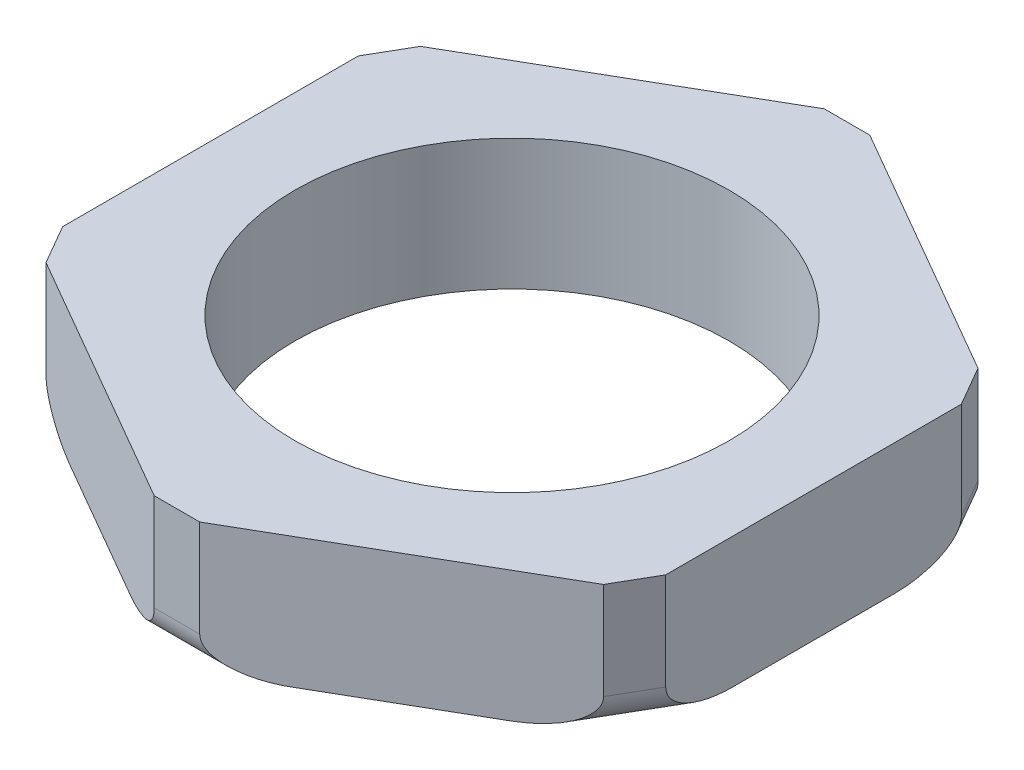
ISO-10303-21;
HEADER;
FILE_DESCRIPTION(('STEP AP214'),'2;1');
FILE_NAME('part.step','',(''),(''),'','','');
FILE_SCHEMA(('AUTOMOTIVE_DESIGN { 1 0 10303 214 1 1 1 1 }'));
ENDSEC;
DATA;
#1=APPLICATION_CONTEXT('core data for automotive mechanical design processes');
#2=APPLICATION_PROTOCOL_DEFINITION('international standard','automotive_design',2000,#1);
#3=PRODUCT_CONTEXT('',#1,'mechanical');
#4=PRODUCT('Part','Part','',(#3));
#5=PRODUCT_RELATED_PRODUCT_CATEGORY('part','',(#4));
#6=PRODUCT_DEFINITION_FORMATION('','',#4);
#7=PRODUCT_DEFINITION_CONTEXT('part definition',#1,'design');
#8=PRODUCT_DEFINITION('design','',#6,#7);
#9=PRODUCT_DEFINITION_SHAPE('','',#8);
#10=(LENGTH_UNIT() NAMED_UNIT(*) SI_UNIT(.MILLI.,.METRE.));
#11=(NAMED_UNIT(*) PLANE_ANGLE_UNIT() SI_UNIT($,.RADIAN.));
#12=(NAMED_UNIT(*) SI_UNIT($,.STERADIAN.) SOLID_ANGLE_UNIT());
#13=UNCERTAINTY_MEASURE_WITH_UNIT(LENGTH_MEASURE(1.E-05),#10,'distance_accuracy_value','');
#14=(GEOMETRIC_REPRESENTATION_CONTEXT(3) GLOBAL_UNCERTAINTY_ASSIGNED_CONTEXT((#13)) GLOBAL_UNIT_ASSIGNED_CONTEXT((#10,
#11,#12)) REPRESENTATION_CONTEXT('',''));
#15=CARTESIAN_POINT('',(0.,0.,0.));
#16=DIRECTION('',(0.,0.,1.));
#17=DIRECTION('',(1.,0.,0.));
#18=AXIS2_PLACEMENT_3D('',#15,#16,#17);
#19=CARTESIAN_POINT('',(-8.66025403784441,3.9,4.99999999999998));
#20=DIRECTION('',(-0.86602540378444,0.,0.499999999999998));
#21=DIRECTION('',(0.499999999999998,0.,0.86602540378444));
#22=AXIS2_PLACEMENT_3D('',#19,#20,#21);
#23=PLANE('',#22);
#24=DIRECTION('',(0.,-1.,0.));
#25=VECTOR('',#24,1.);
#26=CARTESIAN_POINT('',(-8.99999999999999,3.9,4.41154273188012));
#27=LINE('',#26,#25);
#28=CARTESIAN_POINT('',(-8.99999999999999,3.9,4.41154273188012));
#29=VERTEX_POINT('',#28);
#30=CARTESIAN_POINT('',(-8.99999999999999,1.,4.41154273188012));
#31=VERTEX_POINT('',#30);
#32=EDGE_CURVE('E217',#29,#31,#27,.T.);
#33=ORIENTED_EDGE('',*,*,#32,.T.);
#34=DIRECTION('',(-0.499999999999998,0.,-0.86602540378444));
#35=VECTOR('',#34,1.);
#36=CARTESIAN_POINT('',(-8.32050807568879,1.,5.58845726811988));
#37=LINE('',#36,#35);
#38=CARTESIAN_POINT('',(-8.32050807568879,1.,5.58845726811988));
#39=VERTEX_POINT('',#38);
#40=EDGE_CURVE('E168',#31,#39,#37,.F.);
#41=ORIENTED_EDGE('',*,*,#40,.T.);
#42=DIRECTION('',(0.,-1.,0.));
#43=VECTOR('',#42,1.);
#44=CARTESIAN_POINT('',(-8.32050807568879,3.9,5.58845726811988));
#45=LINE('',#44,#43);
#46=CARTESIAN_POINT('',(-8.32050807568879,3.9,5.58845726811988));
#47=VERTEX_POINT('',#46);
#48=EDGE_CURVE('E162',#47,#39,#45,.T.);
#49=ORIENTED_EDGE('',*,*,#48,.F.);
#50=DIRECTION('',(-0.499999999999998,0.,-0.86602540378444));
#51=VECTOR('',#50,1.);
#52=CARTESIAN_POINT('',(-8.66025403784441,3.9,4.99999999999998));
#53=LINE('',#52,#51);
#54=EDGE_CURVE('E165',#47,#29,#53,.T.);
#55=ORIENTED_EDGE('',*,*,#54,.T.);
#56=EDGE_LOOP('',(#33,#41,#49,#55));
#57=FACE_BOUND('',#56,.T.);
#58=ADVANCED_FACE('F37',(#57),#23,.T.);
#59=CARTESIAN_POINT('',(-4.49999999999999,3.9,7.79422863405994));
#60=DIRECTION('',(-0.5,0.,0.866025403784439));
#61=DIRECTION('',(0.866025403784439,0.,0.5));
#62=AXIS2_PLACEMENT_3D('',#59,#60,#61);
#63=PLANE('',#62);
#64=ORIENTED_EDGE('',*,*,#48,.T.);
#65=CARTESIAN_POINT('',(-6.58845726811993,1.,6.58845726811987));
#66=DIRECTION('',(-0.5,0.,0.866025403784439));
#67=DIRECTION('',(0.866025403784439,0.,0.5));
#68=AXIS2_PLACEMENT_3D('',#65,#66,#67);
#69=ELLIPSE('',#68,1.99999999999999,1.);
#70=CARTESIAN_POINT('',(-6.58845726811992,0.,6.58845726811987));
#71=VERTEX_POINT('',#70);
#72=EDGE_CURVE('E294',#39,#71,#69,.T.);
#73=ORIENTED_EDGE('',*,*,#72,.T.);
#74=DIRECTION('',(-0.866025403784439,0.,-0.5));
#75=VECTOR('',#74,1.);
#76=CARTESIAN_POINT('',(-4.49999999999999,0.,7.79422863405994));
#77=LINE('',#76,#75);
#78=CARTESIAN_POINT('',(-2.41154273188009,0.,8.99999999999999));
#79=VERTEX_POINT('',#78);
#80=EDGE_CURVE('E221',#79,#71,#77,.T.);
#81=ORIENTED_EDGE('',*,*,#80,.F.);
#82=CARTESIAN_POINT('',(-2.41154273188009,1.,8.99999999999999));
#83=DIRECTION('',(-0.5,0.,0.866025403784439));
#84=DIRECTION('',(0.866025403784439,0.,0.5));
#85=AXIS2_PLACEMENT_3D('',#82,#83,#84);
#86=ELLIPSE('',#85,2.,1.);
#87=CARTESIAN_POINT('',(-0.679491924311216,1.,9.99999999999999));
#88=VERTEX_POINT('',#87);
#89=EDGE_CURVE('E292',#79,#88,#86,.T.);
#90=ORIENTED_EDGE('',*,*,#89,.T.);
#91=DIRECTION('',(0.,-1.,0.));
#92=VECTOR('',#91,1.);
#93=CARTESIAN_POINT('',(-0.679491924311216,3.9,9.99999999999999));
#94=LINE('',#93,#92);
#95=CARTESIAN_POINT('',(-0.679491924311216,3.9,9.99999999999999));
#96=VERTEX_POINT('',#95);
#97=EDGE_CURVE('E173',#96,#88,#94,.T.);
#98=ORIENTED_EDGE('',*,*,#97,.F.);
#99=DIRECTION('',(-0.866025403784439,0.,-0.5));
#100=VECTOR('',#99,1.);
#101=CARTESIAN_POINT('',(-4.49999999999999,3.9,7.79422863405994));
#102=LINE('',#101,#100);
#103=EDGE_CURVE('E179',#96,#47,#102,.T.);
#104=ORIENTED_EDGE('',*,*,#103,.T.);
#105=EDGE_LOOP('',(#64,#73,#81,#90,#98,#104));
#106=FACE_BOUND('',#105,.T.);
#107=ADVANCED_FACE('F186',(#106),#63,.T.);
#108=CARTESIAN_POINT('',(0.,3.9,9.99999999999999));
#109=DIRECTION('',(0.,0.,1.));
#110=DIRECTION('',(1.,0.,0.));
#111=AXIS2_PLACEMENT_3D('',#108,#109,#110);
#112=PLANE('',#111);
#113=ORIENTED_EDGE('',*,*,#97,.T.);
#114=DIRECTION('',(-1.,0.,0.));
#115=VECTOR('',#114,1.);
#116=CARTESIAN_POINT('',(0.6794919243112,1.,9.99999999999999));
#117=LINE('',#116,#115);
#118=CARTESIAN_POINT('',(0.6794919243112,1.,9.99999999999999));
#119=VERTEX_POINT('',#118);
#120=EDGE_CURVE('E296',#88,#119,#117,.F.);
#121=ORIENTED_EDGE('',*,*,#120,.T.);
#122=DIRECTION('',(0.,-1.,0.));
#123=VECTOR('',#122,1.);
#124=CARTESIAN_POINT('',(0.6794919243112,3.9,9.99999999999999));
#125=LINE('',#124,#123);
#126=CARTESIAN_POINT('',(0.6794919243112,3.9,9.99999999999999));
#127=VERTEX_POINT('',#126);
#128=EDGE_CURVE('E261',#127,#119,#125,.T.);
#129=ORIENTED_EDGE('',*,*,#128,.F.);
#130=DIRECTION('',(-1.,0.,0.));
#131=VECTOR('',#130,1.);
#132=CARTESIAN_POINT('',(0.,3.9,9.99999999999999));
#133=LINE('',#132,#131);
#134=EDGE_CURVE('E188',#127,#96,#133,.T.);
#135=ORIENTED_EDGE('',*,*,#134,.T.);
#136=EDGE_LOOP('',(#113,#121,#129,#135));
#137=FACE_BOUND('',#136,.T.);
#138=ADVANCED_FACE('F356',(#137),#112,.T.);
#139=CARTESIAN_POINT('',(4.49999999999998,3.9,7.79422863405995));
#140=DIRECTION('',(0.499999999999998,0.,0.86602540378444));
#141=DIRECTION('',(0.86602540378444,0.,-0.499999999999998));
#142=AXIS2_PLACEMENT_3D('',#139,#140,#141);
#143=PLANE('',#142);
#144=ORIENTED_EDGE('',*,*,#128,.T.);
#145=CARTESIAN_POINT('',(2.41154273188008,1.,8.99999999999999));
#146=DIRECTION('',(0.499999999999998,0.,0.86602540378444));
#147=DIRECTION('',(0.86602540378444,0.,-0.499999999999998));
#148=AXIS2_PLACEMENT_3D('',#145,#146,#147);
#149=ELLIPSE('',#148,2.00000000000001,1.);
#150=CARTESIAN_POINT('',(2.41154273188008,0.,8.99999999999999));
#151=VERTEX_POINT('',#150);
#152=EDGE_CURVE('E300',#119,#151,#149,.T.);
#153=ORIENTED_EDGE('',*,*,#152,.T.);
#154=DIRECTION('',(-0.86602540378444,0.,0.499999999999998));
#155=VECTOR('',#154,1.);
#156=CARTESIAN_POINT('',(4.49999999999998,0.,7.79422863405995));
#157=LINE('',#156,#155);
#158=CARTESIAN_POINT('',(6.5884572681199,0.,6.58845726811989));
#159=VERTEX_POINT('',#158);
#160=EDGE_CURVE('E224',#159,#151,#157,.T.);
#161=ORIENTED_EDGE('',*,*,#160,.F.);
#162=CARTESIAN_POINT('',(6.5884572681199,1.,6.58845726811989));
#163=DIRECTION('',(0.499999999999998,0.,0.86602540378444));
#164=DIRECTION('',(0.86602540378444,0.,-0.499999999999998));
#165=AXIS2_PLACEMENT_3D('',#162,#163,#164);
#166=ELLIPSE('',#165,1.99999999999999,1.);
#167=CARTESIAN_POINT('',(8.32050807568877,1.,5.5884572681199));
#168=VERTEX_POINT('',#167);
#169=EDGE_CURVE('E298',#159,#168,#166,.T.);
#170=ORIENTED_EDGE('',*,*,#169,.T.);
#171=DIRECTION('',(0.,-1.,0.));
#172=VECTOR('',#171,1.);
#173=CARTESIAN_POINT('',(8.32050807568877,3.9,5.5884572681199));
#174=LINE('',#173,#172);
#175=CARTESIAN_POINT('',(8.32050807568877,3.9,5.5884572681199));
#176=VERTEX_POINT('',#175);
#177=EDGE_CURVE('E258',#176,#168,#174,.T.);
#178=ORIENTED_EDGE('',*,*,#177,.F.);
#179=DIRECTION('',(-0.86602540378444,0.,0.499999999999998));
#180=VECTOR('',#179,1.);
#181=CARTESIAN_POINT('',(4.49999999999998,3.9,7.79422863405995));
#182=LINE('',#181,#180);
#183=EDGE_CURVE('E190',#176,#127,#182,.T.);
#184=ORIENTED_EDGE('',*,*,#183,.T.);
#185=EDGE_LOOP('',(#144,#153,#161,#170,#178,#184));
#186=FACE_BOUND('',#185,.T.);
#187=ADVANCED_FACE('F359',(#186),#143,.T.);
#188=CARTESIAN_POINT('',(8.66025403784439,3.9,5.));
#189=DIRECTION('',(-0.866025403784439,0.,-0.5));
#190=DIRECTION('',(-0.5,0.,0.866025403784439));
#191=AXIS2_PLACEMENT_3D('',#188,#189,#190);
#192=PLANE('',#191);
#193=ORIENTED_EDGE('',*,*,#177,.T.);
#194=DIRECTION('',(0.5,0.,-0.866025403784439));
#195=VECTOR('',#194,1.);
#196=CARTESIAN_POINT('',(8.66025403784439,1.,5.));
#197=LINE('',#196,#195);
#198=CARTESIAN_POINT('',(9.,1.,4.4115427318801));
#199=VERTEX_POINT('',#198);
#200=EDGE_CURVE('E302',#168,#199,#197,.T.);
#201=ORIENTED_EDGE('',*,*,#200,.T.);
#202=DIRECTION('',(0.,-1.,0.));
#203=VECTOR('',#202,1.);
#204=CARTESIAN_POINT('',(9.,3.9,4.4115427318801));
#205=LINE('',#204,#203);
#206=CARTESIAN_POINT('',(9.,3.9,4.4115427318801));
#207=VERTEX_POINT('',#206);
#208=EDGE_CURVE('E255',#207,#199,#205,.T.);
#209=ORIENTED_EDGE('',*,*,#208,.F.);
#210=DIRECTION('',(0.5,0.,-0.866025403784439));
#211=VECTOR('',#210,1.);
#212=CARTESIAN_POINT('',(8.66025403784439,3.9,5.));
#213=LINE('',#212,#211);
#214=EDGE_CURVE('E196',#176,#207,#213,.T.);
#215=ORIENTED_EDGE('',*,*,#214,.F.);
#216=EDGE_LOOP('',(#193,#201,#209,#215));
#217=FACE_BOUND('',#216,.T.);
#218=ADVANCED_FACE('F365',(#217),#192,.F.);
#219=CARTESIAN_POINT('',(8.99999999999999,3.9,0.));
#220=DIRECTION('',(1.,0.,0.));
#221=DIRECTION('',(0.,0.,-1.));
#222=AXIS2_PLACEMENT_3D('',#219,#220,#221);
#223=PLANE('',#222);
#224=ORIENTED_EDGE('',*,*,#208,.T.);
#225=CARTESIAN_POINT('',(8.99999999999999,1.,2.41154273188011));
#226=DIRECTION('',(1.,0.,0.));
#227=DIRECTION('',(0.,0.,-1.));
#228=AXIS2_PLACEMENT_3D('',#225,#226,#227);
#229=ELLIPSE('',#228,1.99999999999999,1.);
#230=CARTESIAN_POINT('',(9.,0.,2.41154273188011));
#231=VERTEX_POINT('',#230);
#232=EDGE_CURVE('E307',#199,#231,#229,.T.);
#233=ORIENTED_EDGE('',*,*,#232,.T.);
#234=DIRECTION('',(0.,0.,1.));
#235=VECTOR('',#234,1.);
#236=CARTESIAN_POINT('',(8.99999999999999,0.,0.));
#237=LINE('',#236,#235);
#238=CARTESIAN_POINT('',(8.99999999999998,0.,-2.41154273188011));
#239=VERTEX_POINT('',#238);
#240=EDGE_CURVE('E227',#239,#231,#237,.T.);
#241=ORIENTED_EDGE('',*,*,#240,.F.);
#242=CARTESIAN_POINT('',(8.99999999999998,1.,-2.41154273188011));
#243=DIRECTION('',(1.,0.,0.));
#244=DIRECTION('',(0.,0.,-1.));
#245=AXIS2_PLACEMENT_3D('',#242,#243,#244);
#246=ELLIPSE('',#245,2.00000000000002,1.);
#247=CARTESIAN_POINT('',(8.99999999999998,1.,-4.41154273188012));
#248=VERTEX_POINT('',#247);
#249=EDGE_CURVE('E305',#239,#248,#246,.T.);
#250=ORIENTED_EDGE('',*,*,#249,.T.);
#251=DIRECTION('',(0.,-1.,0.));
#252=VECTOR('',#251,1.);
#253=CARTESIAN_POINT('',(8.99999999999998,3.9,-4.41154273188012));
#254=LINE('',#253,#252);
#255=CARTESIAN_POINT('',(8.99999999999998,3.9,-4.41154273188012));
#256=VERTEX_POINT('',#255);
#257=EDGE_CURVE('E253',#256,#248,#254,.T.);
#258=ORIENTED_EDGE('',*,*,#257,.F.);
#259=DIRECTION('',(0.,0.,1.));
#260=VECTOR('',#259,1.);
#261=CARTESIAN_POINT('',(8.99999999999999,3.9,0.));
#262=LINE('',#261,#260);
#263=EDGE_CURVE('E198',#256,#207,#262,.T.);
#264=ORIENTED_EDGE('',*,*,#263,.T.);
#265=EDGE_LOOP('',(#224,#233,#241,#250,#258,#264));
#266=FACE_BOUND('',#265,.T.);
#267=ADVANCED_FACE('F320',(#266),#223,.T.);
#268=CARTESIAN_POINT('',(8.66025403784439,3.9,-4.99999999999998));
#269=DIRECTION('',(0.86602540378444,0.,-0.499999999999998));
#270=DIRECTION('',(-0.499999999999998,0.,-0.86602540378444));
#271=AXIS2_PLACEMENT_3D('',#268,#269,#270);
#272=PLANE('',#271);
#273=ORIENTED_EDGE('',*,*,#257,.T.);
#274=DIRECTION('',(0.499999999999998,0.,0.86602540378444));
#275=VECTOR('',#274,1.);
#276=CARTESIAN_POINT('',(8.32050807568877,1.,-5.58845726811989));
#277=LINE('',#276,#275);
#278=CARTESIAN_POINT('',(8.32050807568877,1.,-5.58845726811988));
#279=VERTEX_POINT('',#278);
#280=EDGE_CURVE('E60',#248,#279,#277,.F.);
#281=ORIENTED_EDGE('',*,*,#280,.T.);
#282=DIRECTION('',(0.,-1.,0.));
#283=VECTOR('',#282,1.);
#284=CARTESIAN_POINT('',(8.32050807568877,3.9,-5.58845726811988));
#285=LINE('',#284,#283);
#286=CARTESIAN_POINT('',(8.32050807568877,3.9,-5.58845726811988));
#287=VERTEX_POINT('',#286);
#288=EDGE_CURVE('E251',#287,#279,#285,.T.);
#289=ORIENTED_EDGE('',*,*,#288,.F.);
#290=DIRECTION('',(0.499999999999998,0.,0.86602540378444));
#291=VECTOR('',#290,1.);
#292=CARTESIAN_POINT('',(8.66025403784439,3.9,-4.99999999999998));
#293=LINE('',#292,#291);
#294=EDGE_CURVE('E201',#287,#256,#293,.T.);
#295=ORIENTED_EDGE('',*,*,#294,.T.);
#296=EDGE_LOOP('',(#273,#281,#289,#295));
#297=FACE_BOUND('',#296,.T.);
#298=ADVANCED_FACE('F322',(#297),#272,.T.);
#299=CARTESIAN_POINT('',(4.49999999999999,3.9,-7.79422863405994));
#300=DIRECTION('',(0.5,0.,-0.866025403784439));
#301=DIRECTION('',(-0.866025403784439,0.,-0.5));
#302=AXIS2_PLACEMENT_3D('',#299,#300,#301);
#303=PLANE('',#302);
#304=ORIENTED_EDGE('',*,*,#288,.T.);
#305=CARTESIAN_POINT('',(6.58845726811991,1.,-6.58845726811987));
#306=DIRECTION('',(0.5,0.,-0.866025403784439));
#307=DIRECTION('',(-0.866025403784439,0.,-0.5));
#308=AXIS2_PLACEMENT_3D('',#305,#306,#307);
#309=ELLIPSE('',#308,1.99999999999999,1.);
#310=CARTESIAN_POINT('',(6.58845726811991,0.,-6.58845726811988));
#311=VERTEX_POINT('',#310);
#312=EDGE_CURVE('E45',#279,#311,#309,.T.);
#313=ORIENTED_EDGE('',*,*,#312,.T.);
#314=DIRECTION('',(0.866025403784439,0.,0.5));
#315=VECTOR('',#314,1.);
#316=CARTESIAN_POINT('',(4.49999999999999,0.,-7.79422863405994));
#317=LINE('',#316,#315);
#318=CARTESIAN_POINT('',(2.41154273188008,0.,-9.));
#319=VERTEX_POINT('',#318);
#320=EDGE_CURVE('E230',#319,#311,#317,.T.);
#321=ORIENTED_EDGE('',*,*,#320,.F.);
#322=CARTESIAN_POINT('',(2.41154273188008,1.,-9.));
#323=DIRECTION('',(0.5,0.,-0.866025403784439));
#324=DIRECTION('',(-0.866025403784439,0.,-0.5));
#325=AXIS2_PLACEMENT_3D('',#322,#323,#324);
#326=ELLIPSE('',#325,2.00000000000001,1.);
#327=CARTESIAN_POINT('',(0.679491924311198,1.,-10.));
#328=VERTEX_POINT('',#327);
#329=EDGE_CURVE('E52',#319,#328,#326,.T.);
#330=ORIENTED_EDGE('',*,*,#329,.T.);
#331=DIRECTION('',(0.,-1.,0.));
#332=VECTOR('',#331,1.);
#333=CARTESIAN_POINT('',(0.679491924311198,3.9,-10.));
#334=LINE('',#333,#332);
#335=CARTESIAN_POINT('',(0.679491924311198,3.9,-10.));
#336=VERTEX_POINT('',#335);
#337=EDGE_CURVE('E249',#336,#328,#334,.T.);
#338=ORIENTED_EDGE('',*,*,#337,.F.);
#339=DIRECTION('',(0.866025403784439,0.,0.5));
#340=VECTOR('',#339,1.);
#341=CARTESIAN_POINT('',(4.49999999999999,3.9,-7.79422863405994));
#342=LINE('',#341,#340);
#343=EDGE_CURVE('E204',#336,#287,#342,.T.);
#344=ORIENTED_EDGE('',*,*,#343,.T.);
#345=EDGE_LOOP('',(#304,#313,#321,#330,#338,#344));
#346=FACE_BOUND('',#345,.T.);
#347=ADVANCED_FACE('F311',(#346),#303,.T.);
#348=CARTESIAN_POINT('',(0.,3.9,-10.));
#349=DIRECTION('',(0.,0.,-1.));
#350=DIRECTION('',(-1.,0.,0.));
#351=AXIS2_PLACEMENT_3D('',#348,#349,#350);
#352=PLANE('',#351);
#353=ORIENTED_EDGE('',*,*,#337,.T.);
#354=DIRECTION('',(1.,0.,0.));
#355=VECTOR('',#354,1.);
#356=CARTESIAN_POINT('',(-0.679491924311217,1.,-10.));
#357=LINE('',#356,#355);
#358=CARTESIAN_POINT('',(-0.679491924311217,1.,-10.));
#359=VERTEX_POINT('',#358);
#360=EDGE_CURVE('E11',#328,#359,#357,.F.);
#361=ORIENTED_EDGE('',*,*,#360,.T.);
#362=DIRECTION('',(0.,-1.,0.));
#363=VECTOR('',#362,1.);
#364=CARTESIAN_POINT('',(-0.679491924311217,3.9,-10.));
#365=LINE('',#364,#363);
#366=CARTESIAN_POINT('',(-0.679491924311217,3.9,-10.));
#367=VERTEX_POINT('',#366);
#368=EDGE_CURVE('E246',#367,#359,#365,.T.);
#369=ORIENTED_EDGE('',*,*,#368,.F.);
#370=DIRECTION('',(1.,0.,0.));
#371=VECTOR('',#370,1.);
#372=CARTESIAN_POINT('',(0.,3.9,-10.));
#373=LINE('',#372,#371);
#374=EDGE_CURVE('E207',#367,#336,#373,.T.);
#375=ORIENTED_EDGE('',*,*,#374,.T.);
#376=EDGE_LOOP('',(#353,#361,#369,#375));
#377=FACE_BOUND('',#376,.T.);
#378=ADVANCED_FACE('F328',(#377),#352,.T.);
#379=CARTESIAN_POINT('',(-4.5,3.9,-7.79422863405995));
#380=DIRECTION('',(-0.5,0.,-0.866025403784438));
#381=DIRECTION('',(-0.866025403784439,0.,0.5));
#382=AXIS2_PLACEMENT_3D('',#379,#380,#381);
#383=PLANE('',#382);
#384=DIRECTION('',(0.866025403784439,0.,-0.5));
#385=VECTOR('',#384,1.);
#386=CARTESIAN_POINT('',(-4.5,0.,-7.79422863405995));
#387=LINE('',#386,#385);
#388=CARTESIAN_POINT('',(-6.5884572681199,0.,-6.58845726811989));
#389=VERTEX_POINT('',#388);
#390=CARTESIAN_POINT('',(-2.41154273188009,0.,-9.00000000000001));
#391=VERTEX_POINT('',#390);
#392=EDGE_CURVE('E233',#389,#391,#387,.T.);
#393=ORIENTED_EDGE('',*,*,#392,.F.);
#394=CARTESIAN_POINT('',(-6.5884572681199,1.,-6.58845726811989));
#395=DIRECTION('',(-0.5,0.,-0.866025403784438));
#396=DIRECTION('',(-0.866025403784439,0.,0.5));
#397=AXIS2_PLACEMENT_3D('',#394,#395,#396);
#398=ELLIPSE('',#397,2.,1.);
#399=CARTESIAN_POINT('',(-8.32050807568877,1.,-5.58845726811989));
#400=VERTEX_POINT('',#399);
#401=EDGE_CURVE('E283',#389,#400,#398,.T.);
#402=ORIENTED_EDGE('',*,*,#401,.T.);
#403=DIRECTION('',(0.,-1.,0.));
#404=VECTOR('',#403,1.);
#405=CARTESIAN_POINT('',(-8.32050807568877,3.9,-5.58845726811989));
#406=LINE('',#405,#404);
#407=CARTESIAN_POINT('',(-8.32050807568877,3.9,-5.58845726811989));
#408=VERTEX_POINT('',#407);
#409=EDGE_CURVE('E243',#408,#400,#406,.T.);
#410=ORIENTED_EDGE('',*,*,#409,.F.);
#411=DIRECTION('',(0.866025403784439,0.,-0.5));
#412=VECTOR('',#411,1.);
#413=CARTESIAN_POINT('',(-4.5,3.9,-7.79422863405995));
#414=LINE('',#413,#412);
#415=EDGE_CURVE('E210',#408,#367,#414,.T.);
#416=ORIENTED_EDGE('',*,*,#415,.T.);
#417=ORIENTED_EDGE('',*,*,#368,.T.);
#418=CARTESIAN_POINT('',(-2.41154273188009,1.,-9.00000000000001));
#419=DIRECTION('',(-0.5,0.,-0.866025403784438));
#420=DIRECTION('',(-0.866025403784439,0.,0.5));
#421=AXIS2_PLACEMENT_3D('',#418,#419,#420);
#422=ELLIPSE('',#421,1.99999999999999,1.);
#423=EDGE_CURVE('E281',#359,#391,#422,.T.);
#424=ORIENTED_EDGE('',*,*,#423,.T.);
#425=EDGE_LOOP('',(#393,#402,#410,#416,#417,#424));
#426=FACE_BOUND('',#425,.T.);
#427=ADVANCED_FACE('F333',(#426),#383,.T.);
#428=CARTESIAN_POINT('',(-8.66025403784439,3.9,-5.));
#429=DIRECTION('',(-0.866025403784439,0.,-0.5));
#430=DIRECTION('',(-0.5,0.,0.866025403784439));
#431=AXIS2_PLACEMENT_3D('',#428,#429,#430);
#432=PLANE('',#431);
#433=ORIENTED_EDGE('',*,*,#409,.T.);
#434=DIRECTION('',(0.5,0.,-0.866025403784439));
#435=VECTOR('',#434,1.);
#436=CARTESIAN_POINT('',(-9.,1.,-4.4115427318801));
#437=LINE('',#436,#435);
#438=CARTESIAN_POINT('',(-9.,1.,-4.4115427318801));
#439=VERTEX_POINT('',#438);
#440=EDGE_CURVE('E285',#400,#439,#437,.F.);
#441=ORIENTED_EDGE('',*,*,#440,.T.);
#442=DIRECTION('',(0.,-1.,0.));
#443=VECTOR('',#442,1.);
#444=CARTESIAN_POINT('',(-9.,3.9,-4.4115427318801));
#445=LINE('',#444,#443);
#446=CARTESIAN_POINT('',(-9.,3.9,-4.4115427318801));
#447=VERTEX_POINT('',#446);
#448=EDGE_CURVE('E240',#447,#439,#445,.T.);
#449=ORIENTED_EDGE('',*,*,#448,.F.);
#450=DIRECTION('',(0.5,0.,-0.866025403784439));
#451=VECTOR('',#450,1.);
#452=CARTESIAN_POINT('',(-8.66025403784439,3.9,-5.));
#453=LINE('',#452,#451);
#454=EDGE_CURVE('E213',#447,#408,#453,.T.);
#455=ORIENTED_EDGE('',*,*,#454,.T.);
#456=EDGE_LOOP('',(#433,#441,#449,#455));
#457=FACE_BOUND('',#456,.T.);
#458=ADVANCED_FACE('F342',(#457),#432,.T.);
#459=CARTESIAN_POINT('',(0.,3.9,0.));
#460=DIRECTION('',(0.,-1.,0.));
#461=DIRECTION('',(0.,0.,-1.));
#462=AXIS2_PLACEMENT_3D('',#459,#460,#461);
#463=CYLINDRICAL_SURFACE('',#462,6.48);
#464=CARTESIAN_POINT('',(0.,3.9,0.));
#465=DIRECTION('',(0.,1.,0.));
#466=DIRECTION('',(0.,0.,1.));
#467=AXIS2_PLACEMENT_3D('',#464,#465,#466);
#468=CIRCLE('',#467,6.48);
#469=CARTESIAN_POINT('',(0.,3.9,6.48));
#470=VERTEX_POINT('',#469);
#471=EDGE_CURVE('E184',#470,#470,#468,.T.);
#472=ORIENTED_EDGE('',*,*,#471,.T.);
#473=EDGE_LOOP('',(#472));
#474=FACE_BOUND('',#473,.T.);
#475=CARTESIAN_POINT('',(0.,0.,0.));
#476=DIRECTION('',(0.,1.,0.));
#477=DIRECTION('',(0.,0.,1.));
#478=AXIS2_PLACEMENT_3D('',#475,#476,#477);
#479=CIRCLE('',#478,6.48);
#480=CARTESIAN_POINT('',(0.,0.,6.48));
#481=VERTEX_POINT('',#480);
#482=EDGE_CURVE('E218',#481,#481,#479,.T.);
#483=ORIENTED_EDGE('',*,*,#482,.F.);
#484=EDGE_LOOP('',(#483));
#485=FACE_BOUND('',#484,.T.);
#486=ADVANCED_FACE('F384',(#474,#485),#463,.F.);
#487=CARTESIAN_POINT('',(-9.,3.9,0.));
#488=DIRECTION('',(-1.,0.,0.));
#489=DIRECTION('',(0.,0.,1.));
#490=AXIS2_PLACEMENT_3D('',#487,#488,#489);
#491=PLANE('',#490);
#492=ORIENTED_EDGE('',*,*,#448,.T.);
#493=CARTESIAN_POINT('',(-9.,1.,-2.4115427318801));
#494=DIRECTION('',(-1.,0.,0.));
#495=DIRECTION('',(0.,0.,1.));
#496=AXIS2_PLACEMENT_3D('',#493,#494,#495);
#497=ELLIPSE('',#496,2.,1.);
#498=CARTESIAN_POINT('',(-9.,0.,-2.4115427318801));
#499=VERTEX_POINT('',#498);
#500=EDGE_CURVE('E289',#439,#499,#497,.T.);
#501=ORIENTED_EDGE('',*,*,#500,.T.);
#502=DIRECTION('',(0.,0.,-1.));
#503=VECTOR('',#502,1.);
#504=CARTESIAN_POINT('',(-9.,0.,0.));
#505=LINE('',#504,#503);
#506=CARTESIAN_POINT('',(-9.,0.,2.41154273188011));
#507=VERTEX_POINT('',#506);
#508=EDGE_CURVE('E236',#507,#499,#505,.T.);
#509=ORIENTED_EDGE('',*,*,#508,.F.);
#510=CARTESIAN_POINT('',(-9.,1.,2.41154273188011));
#511=DIRECTION('',(-1.,0.,0.));
#512=DIRECTION('',(0.,0.,1.));
#513=AXIS2_PLACEMENT_3D('',#510,#511,#512);
#514=ELLIPSE('',#513,2.00000000000001,1.);
#515=EDGE_CURVE('E287',#507,#31,#514,.T.);
#516=ORIENTED_EDGE('',*,*,#515,.T.);
#517=ORIENTED_EDGE('',*,*,#32,.F.);
#518=DIRECTION('',(0.,0.,-1.));
#519=VECTOR('',#518,1.);
#520=CARTESIAN_POINT('',(-9.,3.9,0.));
#521=LINE('',#520,#519);
#522=EDGE_CURVE('E183',#29,#447,#521,.T.);
#523=ORIENTED_EDGE('',*,*,#522,.T.);
#524=EDGE_LOOP('',(#492,#501,#509,#516,#517,#523));
#525=FACE_BOUND('',#524,.T.);
#526=ADVANCED_FACE('F344',(#525),#491,.T.);
#527=CARTESIAN_POINT('',(0.,3.9,0.));
#528=DIRECTION('',(0.,1.,0.));
#529=DIRECTION('',(0.,0.,1.));
#530=AXIS2_PLACEMENT_3D('',#527,#528,#529);
#531=PLANE('',#530);
#532=ORIENTED_EDGE('',*,*,#471,.F.);
#533=EDGE_LOOP('',(#532));
#534=FACE_BOUND('',#533,.T.);
#535=ORIENTED_EDGE('',*,*,#54,.F.);
#536=ORIENTED_EDGE('',*,*,#103,.F.);
#537=ORIENTED_EDGE('',*,*,#134,.F.);
#538=ORIENTED_EDGE('',*,*,#183,.F.);
#539=ORIENTED_EDGE('',*,*,#214,.T.);
#540=ORIENTED_EDGE('',*,*,#263,.F.);
#541=ORIENTED_EDGE('',*,*,#294,.F.);
#542=ORIENTED_EDGE('',*,*,#343,.F.);
#543=ORIENTED_EDGE('',*,*,#374,.F.);
#544=ORIENTED_EDGE('',*,*,#415,.F.);
#545=ORIENTED_EDGE('',*,*,#454,.F.);
#546=ORIENTED_EDGE('',*,*,#522,.F.);
#547=EDGE_LOOP('',(#535,#536,#537,#538,#539,#540,#541,#542,#543,#544,#545,#546));
#548=FACE_BOUND('',#547,.T.);
#549=ADVANCED_FACE('F177',(#534,#548),#531,.T.);
#550=CARTESIAN_POINT('',(0.,0.,0.));
#551=DIRECTION('',(0.,1.,0.));
#552=DIRECTION('',(0.,0.,1.));
#553=AXIS2_PLACEMENT_3D('',#550,#551,#552);
#554=PLANE('',#553);
#555=ORIENTED_EDGE('',*,*,#482,.T.);
#556=EDGE_LOOP('',(#555));
#557=FACE_BOUND('',#556,.T.);
#558=ORIENTED_EDGE('',*,*,#508,.T.);
#559=DIRECTION('',(0.5,0.,-0.866025403784439));
#560=VECTOR('',#559,1.);
#561=CARTESIAN_POINT('',(-7.45448267190434,0.,-5.08845726811989));
#562=LINE('',#561,#560);
#563=EDGE_CURVE('E278',#499,#389,#562,.T.);
#564=ORIENTED_EDGE('',*,*,#563,.T.);
#565=ORIENTED_EDGE('',*,*,#392,.T.);
#566=DIRECTION('',(1.,0.,0.));
#567=VECTOR('',#566,1.);
#568=CARTESIAN_POINT('',(0.679491924311195,0.,-9.));
#569=LINE('',#568,#567);
#570=EDGE_CURVE('E172',#391,#319,#569,.T.);
#571=ORIENTED_EDGE('',*,*,#570,.T.);
#572=ORIENTED_EDGE('',*,*,#320,.T.);
#573=DIRECTION('',(0.499999999999998,0.,0.86602540378444));
#574=VECTOR('',#573,1.);
#575=CARTESIAN_POINT('',(8.13397459621554,0.,-3.91154273188013));
#576=LINE('',#575,#574);
#577=EDGE_CURVE('E267',#311,#239,#576,.T.);
#578=ORIENTED_EDGE('',*,*,#577,.T.);
#579=ORIENTED_EDGE('',*,*,#240,.T.);
#580=DIRECTION('',(0.5,0.,-0.866025403784439));
#581=VECTOR('',#580,1.);
#582=CARTESIAN_POINT('',(7.79422863405995,0.,4.5));
#583=LINE('',#582,#581);
#584=EDGE_CURVE('E270',#231,#159,#583,.F.);
#585=ORIENTED_EDGE('',*,*,#584,.T.);
#586=ORIENTED_EDGE('',*,*,#160,.T.);
#587=DIRECTION('',(-1.,0.,0.));
#588=VECTOR('',#587,1.);
#589=CARTESIAN_POINT('',(-0.679491924311216,0.,8.99999999999999));
#590=LINE('',#589,#588);
#591=EDGE_CURVE('E272',#151,#79,#590,.T.);
#592=ORIENTED_EDGE('',*,*,#591,.T.);
#593=ORIENTED_EDGE('',*,*,#80,.T.);
#594=DIRECTION('',(-0.499999999999998,0.,-0.86602540378444));
#595=VECTOR('',#594,1.);
#596=CARTESIAN_POINT('',(-8.13397459621556,0.,3.91154273188012));
#597=LINE('',#596,#595);
#598=EDGE_CURVE('E275',#71,#507,#597,.T.);
#599=ORIENTED_EDGE('',*,*,#598,.T.);
#600=EDGE_LOOP('',(#558,#564,#565,#571,#572,#578,#579,#585,#586,#592,#593,#599));
#601=FACE_BOUND('',#600,.T.);
#602=ADVANCED_FACE('F315',(#557,#601),#554,.F.);
#603=CARTESIAN_POINT('',(-7.79422863405995,1.,-4.5));
#604=DIRECTION('',(-0.5,0.,0.866025403784439));
#605=DIRECTION('',(0.866025403784439,0.,0.5));
#606=AXIS2_PLACEMENT_3D('',#603,#604,#605);
#607=CYLINDRICAL_SURFACE('',#606,1.);
#608=ORIENTED_EDGE('',*,*,#500,.F.);
#609=ORIENTED_EDGE('',*,*,#440,.F.);
#610=ORIENTED_EDGE('',*,*,#401,.F.);
#611=ORIENTED_EDGE('',*,*,#563,.F.);
#612=EDGE_LOOP('',(#608,#609,#610,#611));
#613=FACE_BOUND('',#612,.T.);
#614=ADVANCED_FACE('F338',(#613),#607,.T.);
#615=CARTESIAN_POINT('',(-7.79422863405997,1.,4.49999999999998));
#616=DIRECTION('',(0.499999999999998,0.,0.86602540378444));
#617=DIRECTION('',(0.86602540378444,0.,-0.499999999999998));
#618=AXIS2_PLACEMENT_3D('',#615,#616,#617);
#619=CYLINDRICAL_SURFACE('',#618,1.);
#620=ORIENTED_EDGE('',*,*,#72,.F.);
#621=ORIENTED_EDGE('',*,*,#40,.F.);
#622=ORIENTED_EDGE('',*,*,#515,.F.);
#623=ORIENTED_EDGE('',*,*,#598,.F.);
#624=EDGE_LOOP('',(#620,#621,#622,#623));
#625=FACE_BOUND('',#624,.T.);
#626=ADVANCED_FACE('F346',(#625),#619,.T.);
#627=CARTESIAN_POINT('',(0.,1.,8.99999999999999));
#628=DIRECTION('',(1.,0.,0.));
#629=DIRECTION('',(0.,0.,-1.));
#630=AXIS2_PLACEMENT_3D('',#627,#628,#629);
#631=CYLINDRICAL_SURFACE('',#630,1.);
#632=ORIENTED_EDGE('',*,*,#152,.F.);
#633=ORIENTED_EDGE('',*,*,#120,.F.);
#634=ORIENTED_EDGE('',*,*,#89,.F.);
#635=ORIENTED_EDGE('',*,*,#591,.F.);
#636=EDGE_LOOP('',(#632,#633,#634,#635));
#637=FACE_BOUND('',#636,.T.);
#638=ADVANCED_FACE('F353',(#637),#631,.T.);
#639=CARTESIAN_POINT('',(7.79422863405995,1.,4.5));
#640=DIRECTION('',(0.5,0.,-0.866025403784439));
#641=DIRECTION('',(-0.866025403784439,0.,-0.5));
#642=AXIS2_PLACEMENT_3D('',#639,#640,#641);
#643=CYLINDRICAL_SURFACE('',#642,1.);
#644=ORIENTED_EDGE('',*,*,#169,.F.);
#645=ORIENTED_EDGE('',*,*,#584,.F.);
#646=ORIENTED_EDGE('',*,*,#232,.F.);
#647=ORIENTED_EDGE('',*,*,#200,.F.);
#648=EDGE_LOOP('',(#644,#645,#646,#647));
#649=FACE_BOUND('',#648,.T.);
#650=ADVANCED_FACE('F368',(#649),#643,.T.);
#651=CARTESIAN_POINT('',(7.79422863405995,1.,-4.49999999999998));
#652=DIRECTION('',(-0.499999999999998,0.,-0.86602540378444));
#653=DIRECTION('',(-0.86602540378444,0.,0.499999999999998));
#654=AXIS2_PLACEMENT_3D('',#651,#652,#653);
#655=CYLINDRICAL_SURFACE('',#654,1.);
#656=ORIENTED_EDGE('',*,*,#312,.F.);
#657=ORIENTED_EDGE('',*,*,#280,.F.);
#658=ORIENTED_EDGE('',*,*,#249,.F.);
#659=ORIENTED_EDGE('',*,*,#577,.F.);
#660=EDGE_LOOP('',(#656,#657,#658,#659));
#661=FACE_BOUND('',#660,.T.);
#662=ADVANCED_FACE('F318',(#661),#655,.T.);
#663=CARTESIAN_POINT('',(0.,1.,-9.00000000000001));
#664=DIRECTION('',(-1.,0.,0.));
#665=DIRECTION('',(0.,0.,1.));
#666=AXIS2_PLACEMENT_3D('',#663,#664,#665);
#667=CYLINDRICAL_SURFACE('',#666,1.);
#668=ORIENTED_EDGE('',*,*,#423,.F.);
#669=ORIENTED_EDGE('',*,*,#360,.F.);
#670=ORIENTED_EDGE('',*,*,#329,.F.);
#671=ORIENTED_EDGE('',*,*,#570,.F.);
#672=EDGE_LOOP('',(#668,#669,#670,#671));
#673=FACE_BOUND('',#672,.T.);
#674=ADVANCED_FACE('F39',(#673),#667,.T.);
#675=CLOSED_SHELL('',(#58,#107,#138,#187,#218,#267,#298,#347,#378,#427,#458,#486,#526,#549,#602,
#614,#626,#638,#650,#662,#674));
#676=MANIFOLD_SOLID_BREP('B2',#675);
#677=ADVANCED_BREP_SHAPE_REPRESENTATION('',(#18,#676),#14);
#678=SHAPE_DEFINITION_REPRESENTATION(#9,#677);
ENDSEC;
END-ISO-10303-21;
